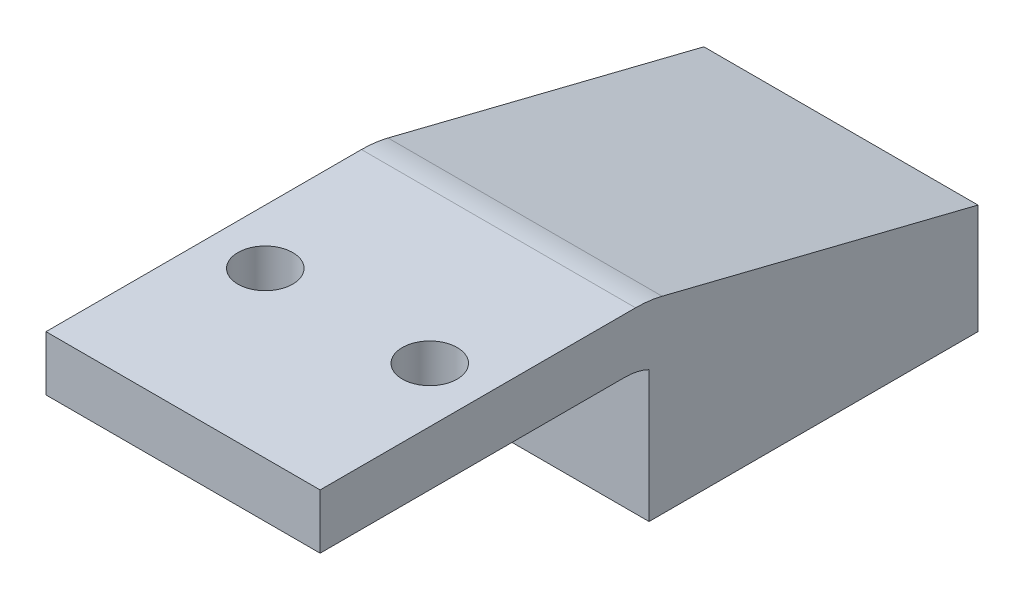
ISO-10303-21;
HEADER;
FILE_DESCRIPTION(('STEP AP214'),'2;1');
FILE_NAME('part.step','',(''),(''),'','','');
FILE_SCHEMA(('AUTOMOTIVE_DESIGN { 1 0 10303 214 1 1 1 1 }'));
ENDSEC;
DATA;
#1=APPLICATION_CONTEXT('core data for automotive mechanical design processes');
#2=APPLICATION_PROTOCOL_DEFINITION('international standard','automotive_design',2000,#1);
#3=PRODUCT_CONTEXT('',#1,'mechanical');
#4=PRODUCT('Part','Part','',(#3));
#5=PRODUCT_RELATED_PRODUCT_CATEGORY('part','',(#4));
#6=PRODUCT_DEFINITION_FORMATION('','',#4);
#7=PRODUCT_DEFINITION_CONTEXT('part definition',#1,'design');
#8=PRODUCT_DEFINITION('design','',#6,#7);
#9=PRODUCT_DEFINITION_SHAPE('','',#8);
#10=(LENGTH_UNIT() NAMED_UNIT(*) SI_UNIT(.MILLI.,.METRE.));
#11=(NAMED_UNIT(*) PLANE_ANGLE_UNIT() SI_UNIT($,.RADIAN.));
#12=(NAMED_UNIT(*) SI_UNIT($,.STERADIAN.) SOLID_ANGLE_UNIT());
#13=UNCERTAINTY_MEASURE_WITH_UNIT(LENGTH_MEASURE(1.E-05),#10,'distance_accuracy_value','');
#14=(GEOMETRIC_REPRESENTATION_CONTEXT(3) GLOBAL_UNCERTAINTY_ASSIGNED_CONTEXT((#13)) GLOBAL_UNIT_ASSIGNED_CONTEXT((#10,
#11,#12)) REPRESENTATION_CONTEXT('',''));
#15=CARTESIAN_POINT('',(0.,0.,0.));
#16=DIRECTION('',(0.,0.,1.));
#17=DIRECTION('',(1.,0.,0.));
#18=AXIS2_PLACEMENT_3D('',#15,#16,#17);
#19=CARTESIAN_POINT('',(50.,-10.,0.));
#20=DIRECTION('',(0.,1.,0.));
#21=DIRECTION('',(0.,0.,1.));
#22=AXIS2_PLACEMENT_3D('',#19,#20,#21);
#23=PLANE('',#22);
#24=DIRECTION('',(-1.,0.,0.));
#25=VECTOR('',#24,1.);
#26=CARTESIAN_POINT('',(50.,-10.,-30.));
#27=LINE('',#26,#25);
#28=CARTESIAN_POINT('',(0.549999999999995,-10.,-30.));
#29=VERTEX_POINT('',#28);
#30=CARTESIAN_POINT('',(0.,-10.,-30.));
#31=VERTEX_POINT('',#30);
#32=EDGE_CURVE('E234',#29,#31,#27,.T.);
#33=ORIENTED_EDGE('',*,*,#32,.F.);
#34=DIRECTION('',(0.,0.,-1.));
#35=VECTOR('',#34,1.);
#36=CARTESIAN_POINT('',(0.549999999999995,-10.,0.));
#37=LINE('',#36,#35);
#38=CARTESIAN_POINT('',(0.549999999999997,-10.,-10.));
#39=VERTEX_POINT('',#38);
#40=EDGE_CURVE('E285',#29,#39,#37,.F.);
#41=ORIENTED_EDGE('',*,*,#40,.T.);
#42=DIRECTION('',(-1.,0.,0.));
#43=VECTOR('',#42,1.);
#44=CARTESIAN_POINT('',(0.,-10.,-10.));
#45=LINE('',#44,#43);
#46=CARTESIAN_POINT('',(11.15,-10.,-10.));
#47=VERTEX_POINT('',#46);
#48=EDGE_CURVE('E205',#47,#39,#45,.T.);
#49=ORIENTED_EDGE('',*,*,#48,.F.);
#50=DIRECTION('',(-1.,0.,0.));
#51=VECTOR('',#50,1.);
#52=CARTESIAN_POINT('',(0.,-10.,-10.));
#53=LINE('',#52,#51);
#54=CARTESIAN_POINT('',(21.75,-10.,-10.));
#55=VERTEX_POINT('',#54);
#56=EDGE_CURVE('E169',#55,#47,#53,.T.);
#57=ORIENTED_EDGE('',*,*,#56,.F.);
#58=DIRECTION('',(0.,0.,-1.));
#59=VECTOR('',#58,1.);
#60=CARTESIAN_POINT('',(21.75,-10.,-30.));
#61=LINE('',#60,#59);
#62=CARTESIAN_POINT('',(21.75,-10.,-30.));
#63=VERTEX_POINT('',#62);
#64=EDGE_CURVE('E282',#55,#63,#61,.T.);
#65=ORIENTED_EDGE('',*,*,#64,.T.);
#66=CARTESIAN_POINT('',(50.,-10.,-30.));
#67=VERTEX_POINT('',#66);
#68=EDGE_CURVE('E250',#67,#63,#27,.T.);
#69=ORIENTED_EDGE('',*,*,#68,.F.);
#70=DIRECTION('',(0.,0.,-1.));
#71=VECTOR('',#70,1.);
#72=CARTESIAN_POINT('',(50.,-10.,0.));
#73=LINE('',#72,#71);
#74=CARTESIAN_POINT('',(50.,-10.,30.));
#75=VERTEX_POINT('',#74);
#76=EDGE_CURVE('E232',#75,#67,#73,.T.);
#77=ORIENTED_EDGE('',*,*,#76,.F.);
#78=DIRECTION('',(-1.,0.,0.));
#79=VECTOR('',#78,1.);
#80=CARTESIAN_POINT('',(50.,-10.,30.));
#81=LINE('',#80,#79);
#82=CARTESIAN_POINT('',(0.,-10.,30.));
#83=VERTEX_POINT('',#82);
#84=EDGE_CURVE('E252',#75,#83,#81,.T.);
#85=ORIENTED_EDGE('',*,*,#84,.T.);
#86=DIRECTION('',(0.,0.,-1.));
#87=VECTOR('',#86,1.);
#88=CARTESIAN_POINT('',(0.,-10.,0.));
#89=LINE('',#88,#87);
#90=EDGE_CURVE('E221',#83,#31,#89,.T.);
#91=ORIENTED_EDGE('',*,*,#90,.T.);
#92=EDGE_LOOP('',(#33,#41,#49,#57,#65,#69,#77,#85,#91));
#93=FACE_BOUND('',#92,.T.);
#94=ADVANCED_FACE('F35',(#93),#23,.F.);
#95=CARTESIAN_POINT('',(50.,0.,-30.));
#96=DIRECTION('',(0.,0.,-1.));
#97=DIRECTION('',(0.,1.,0.));
#98=AXIS2_PLACEMENT_3D('',#95,#96,#97);
#99=PLANE('',#98);
#100=DIRECTION('',(0.,-1.,0.));
#101=VECTOR('',#100,1.);
#102=CARTESIAN_POINT('',(0.,0.,-30.));
#103=LINE('',#102,#101);
#104=CARTESIAN_POINT('',(0.,10.,-30.));
#105=VERTEX_POINT('',#104);
#106=EDGE_CURVE('E216',#105,#31,#103,.T.);
#107=ORIENTED_EDGE('',*,*,#106,.F.);
#108=DIRECTION('',(-1.,0.,0.));
#109=VECTOR('',#108,1.);
#110=CARTESIAN_POINT('',(50.,10.,-30.));
#111=LINE('',#110,#109);
#112=CARTESIAN_POINT('',(50.,10.,-30.));
#113=VERTEX_POINT('',#112);
#114=EDGE_CURVE('E261',#113,#105,#111,.T.);
#115=ORIENTED_EDGE('',*,*,#114,.F.);
#116=DIRECTION('',(0.,-1.,0.));
#117=VECTOR('',#116,1.);
#118=CARTESIAN_POINT('',(50.,0.,-30.));
#119=LINE('',#118,#117);
#120=EDGE_CURVE('E217',#113,#67,#119,.T.);
#121=ORIENTED_EDGE('',*,*,#120,.T.);
#122=ORIENTED_EDGE('',*,*,#68,.T.);
#123=CARTESIAN_POINT('',(21.75,-15.,-30.));
#124=DIRECTION('',(0.,0.,-1.));
#125=DIRECTION('',(0.,1.,0.));
#126=AXIS2_PLACEMENT_3D('',#123,#124,#125);
#127=CIRCLE('',#126,5.);
#128=CARTESIAN_POINT('',(16.75,-15.,-30.));
#129=VERTEX_POINT('',#128);
#130=EDGE_CURVE('E43',#63,#129,#127,.F.);
#131=ORIENTED_EDGE('',*,*,#130,.T.);
#132=DIRECTION('',(0.,1.,0.));
#133=VECTOR('',#132,1.);
#134=CARTESIAN_POINT('',(16.75,0.,-30.));
#135=LINE('',#134,#133);
#136=CARTESIAN_POINT('',(16.75,-15.1,-30.));
#137=VERTEX_POINT('',#136);
#138=EDGE_CURVE('E174',#137,#129,#135,.T.);
#139=ORIENTED_EDGE('',*,*,#138,.F.);
#140=DIRECTION('',(1.,0.,0.));
#141=VECTOR('',#140,1.);
#142=CARTESIAN_POINT('',(1.04777297949E-13,-15.1000000000001,-30.));
#143=LINE('',#142,#141);
#144=CARTESIAN_POINT('',(16.25,-15.1,-30.));
#145=VERTEX_POINT('',#144);
#146=EDGE_CURVE('E171',#145,#137,#143,.T.);
#147=ORIENTED_EDGE('',*,*,#146,.F.);
#148=CARTESIAN_POINT('',(11.15,-15.1,-30.));
#149=DIRECTION('',(0.,0.,-1.));
#150=DIRECTION('',(0.,1.,0.));
#151=AXIS2_PLACEMENT_3D('',#148,#149,#150);
#152=CIRCLE('',#151,5.1);
#153=CARTESIAN_POINT('',(6.05,-15.1,-30.));
#154=VERTEX_POINT('',#153);
#155=EDGE_CURVE('E158',#154,#145,#152,.T.);
#156=ORIENTED_EDGE('',*,*,#155,.F.);
#157=DIRECTION('',(-1.,0.,0.));
#158=VECTOR('',#157,1.);
#159=CARTESIAN_POINT('',(-2.09554595897997E-13,-15.0999999999999,-30.));
#160=LINE('',#159,#158);
#161=CARTESIAN_POINT('',(5.55,-15.1,-30.));
#162=VERTEX_POINT('',#161);
#163=EDGE_CURVE('E168',#154,#162,#160,.T.);
#164=ORIENTED_EDGE('',*,*,#163,.T.);
#165=DIRECTION('',(0.,1.,0.));
#166=VECTOR('',#165,1.);
#167=CARTESIAN_POINT('',(5.55,0.,-30.));
#168=LINE('',#167,#166);
#169=CARTESIAN_POINT('',(5.55,-15.,-30.));
#170=VERTEX_POINT('',#169);
#171=EDGE_CURVE('E199',#162,#170,#168,.T.);
#172=ORIENTED_EDGE('',*,*,#171,.T.);
#173=CARTESIAN_POINT('',(0.549999999999997,-15.,-30.));
#174=DIRECTION('',(0.,0.,-1.));
#175=DIRECTION('',(0.,1.,0.));
#176=AXIS2_PLACEMENT_3D('',#173,#174,#175);
#177=CIRCLE('',#176,5.);
#178=EDGE_CURVE('E289',#170,#29,#177,.F.);
#179=ORIENTED_EDGE('',*,*,#178,.T.);
#180=ORIENTED_EDGE('',*,*,#32,.T.);
#181=EDGE_LOOP('',(#107,#115,#121,#122,#131,#139,#147,#156,#164,#172,#179,#180));
#182=FACE_BOUND('',#181,.T.);
#183=ADVANCED_FACE('F173',(#182),#99,.T.);
#184=CARTESIAN_POINT('',(50.,16.4705882352941,-4.11764705882353));
#185=DIRECTION('',(0.,0.970142500145332,-0.242535625036333));
#186=DIRECTION('',(0.,0.242535625036333,0.970142500145332));
#187=AXIS2_PLACEMENT_3D('',#184,#185,#186);
#188=PLANE('',#187);
#189=DIRECTION('',(0.,-0.242535625036333,-0.970142500145332));
#190=VECTOR('',#189,1.);
#191=CARTESIAN_POINT('',(0.,16.4705882352941,-4.11764705882353));
#192=LINE('',#191,#190);
#193=CARTESIAN_POINT('',(0.,24.4028500029066,27.6114000116265));
#194=VERTEX_POINT('',#193);
#195=EDGE_CURVE('E237',#194,#105,#192,.T.);
#196=ORIENTED_EDGE('',*,*,#195,.F.);
#197=DIRECTION('',(-1.,0.,0.));
#198=VECTOR('',#197,1.);
#199=CARTESIAN_POINT('',(50.,24.4028500029066,27.6114000116265));
#200=LINE('',#199,#198);
#201=CARTESIAN_POINT('',(50.,24.4028500029066,27.6114000116265));
#202=VERTEX_POINT('',#201);
#203=EDGE_CURVE('E269',#194,#202,#200,.F.);
#204=ORIENTED_EDGE('',*,*,#203,.T.);
#205=DIRECTION('',(0.,-0.242535625036333,-0.970142500145332));
#206=VECTOR('',#205,1.);
#207=CARTESIAN_POINT('',(50.,16.4705882352941,-4.11764705882353));
#208=LINE('',#207,#206);
#209=EDGE_CURVE('E220',#202,#113,#208,.T.);
#210=ORIENTED_EDGE('',*,*,#209,.T.);
#211=ORIENTED_EDGE('',*,*,#114,.T.);
#212=EDGE_LOOP('',(#196,#204,#210,#211));
#213=FACE_BOUND('',#212,.T.);
#214=ADVANCED_FACE('F346',(#213),#188,.T.);
#215=CARTESIAN_POINT('',(50.,25.,0.));
#216=DIRECTION('',(0.,-1.,0.));
#217=DIRECTION('',(0.,0.,-1.));
#218=AXIS2_PLACEMENT_3D('',#215,#216,#217);
#219=PLANE('',#218);
#220=CARTESIAN_POINT('',(10.,25.,60.));
#221=DIRECTION('',(0.,1.,0.));
#222=DIRECTION('',(0.,0.,1.));
#223=AXIS2_PLACEMENT_3D('',#220,#221,#222);
#224=CIRCLE('',#223,5.);
#225=CARTESIAN_POINT('',(10.,25.,65.));
#226=VERTEX_POINT('',#225);
#227=EDGE_CURVE('E399',#226,#226,#224,.T.);
#228=ORIENTED_EDGE('',*,*,#227,.F.);
#229=EDGE_LOOP('',(#228));
#230=FACE_BOUND('',#229,.T.);
#231=CARTESIAN_POINT('',(40.,25.,60.));
#232=DIRECTION('',(0.,1.,0.));
#233=DIRECTION('',(0.,0.,1.));
#234=AXIS2_PLACEMENT_3D('',#231,#232,#233);
#235=CIRCLE('',#234,5.);
#236=CARTESIAN_POINT('',(40.,25.,65.));
#237=VERTEX_POINT('',#236);
#238=EDGE_CURVE('E397',#237,#237,#235,.T.);
#239=ORIENTED_EDGE('',*,*,#238,.F.);
#240=EDGE_LOOP('',(#239));
#241=FACE_BOUND('',#240,.T.);
#242=DIRECTION('',(0.,0.,1.));
#243=VECTOR('',#242,1.);
#244=CARTESIAN_POINT('',(50.,25.,0.));
#245=LINE('',#244,#243);
#246=CARTESIAN_POINT('',(50.,25.,32.4621125123532));
#247=VERTEX_POINT('',#246);
#248=CARTESIAN_POINT('',(50.,25.,90.));
#249=VERTEX_POINT('',#248);
#250=EDGE_CURVE('E223',#247,#249,#245,.T.);
#251=ORIENTED_EDGE('',*,*,#250,.F.);
#252=DIRECTION('',(-1.,0.,0.));
#253=VECTOR('',#252,1.);
#254=CARTESIAN_POINT('',(0.,25.,32.4621125123532));
#255=LINE('',#254,#253);
#256=CARTESIAN_POINT('',(0.,25.,32.4621125123532));
#257=VERTEX_POINT('',#256);
#258=EDGE_CURVE('E264',#247,#257,#255,.T.);
#259=ORIENTED_EDGE('',*,*,#258,.T.);
#260=DIRECTION('',(0.,0.,1.));
#261=VECTOR('',#260,1.);
#262=CARTESIAN_POINT('',(0.,25.,0.));
#263=LINE('',#262,#261);
#264=CARTESIAN_POINT('',(0.,25.,90.));
#265=VERTEX_POINT('',#264);
#266=EDGE_CURVE('E239',#257,#265,#263,.T.);
#267=ORIENTED_EDGE('',*,*,#266,.T.);
#268=DIRECTION('',(-1.,0.,0.));
#269=VECTOR('',#268,1.);
#270=CARTESIAN_POINT('',(50.,25.,90.));
#271=LINE('',#270,#269);
#272=EDGE_CURVE('E258',#249,#265,#271,.T.);
#273=ORIENTED_EDGE('',*,*,#272,.F.);
#274=EDGE_LOOP('',(#251,#259,#267,#273));
#275=FACE_BOUND('',#274,.T.);
#276=ADVANCED_FACE('F362',(#230,#241,#275),#219,.F.);
#277=CARTESIAN_POINT('',(50.,0.,90.));
#278=DIRECTION('',(0.,0.,-1.));
#279=DIRECTION('',(-1.,0.,0.));
#280=AXIS2_PLACEMENT_3D('',#277,#278,#279);
#281=PLANE('',#280);
#282=DIRECTION('',(0.,-1.,0.));
#283=VECTOR('',#282,1.);
#284=CARTESIAN_POINT('',(0.,0.,90.));
#285=LINE('',#284,#283);
#286=CARTESIAN_POINT('',(0.,15.,90.));
#287=VERTEX_POINT('',#286);
#288=EDGE_CURVE('E241',#265,#287,#285,.T.);
#289=ORIENTED_EDGE('',*,*,#288,.T.);
#290=DIRECTION('',(-1.,0.,0.));
#291=VECTOR('',#290,1.);
#292=CARTESIAN_POINT('',(50.,15.,90.));
#293=LINE('',#292,#291);
#294=CARTESIAN_POINT('',(50.,15.,90.));
#295=VERTEX_POINT('',#294);
#296=EDGE_CURVE('E255',#295,#287,#293,.T.);
#297=ORIENTED_EDGE('',*,*,#296,.F.);
#298=DIRECTION('',(0.,-1.,0.));
#299=VECTOR('',#298,1.);
#300=CARTESIAN_POINT('',(50.,0.,90.));
#301=LINE('',#300,#299);
#302=EDGE_CURVE('E225',#249,#295,#301,.T.);
#303=ORIENTED_EDGE('',*,*,#302,.F.);
#304=ORIENTED_EDGE('',*,*,#272,.T.);
#305=EDGE_LOOP('',(#289,#297,#303,#304));
#306=FACE_BOUND('',#305,.T.);
#307=ADVANCED_FACE('F358',(#306),#281,.F.);
#308=CARTESIAN_POINT('',(50.,15.,0.));
#309=DIRECTION('',(0.,1.,0.));
#310=DIRECTION('',(0.,0.,1.));
#311=AXIS2_PLACEMENT_3D('',#308,#309,#310);
#312=PLANE('',#311);
#313=CARTESIAN_POINT('',(10.,15.,60.));
#314=DIRECTION('',(0.,1.,0.));
#315=DIRECTION('',(0.,0.,1.));
#316=AXIS2_PLACEMENT_3D('',#313,#314,#315);
#317=CIRCLE('',#316,5.);
#318=CARTESIAN_POINT('',(10.,15.,65.));
#319=VERTEX_POINT('',#318);
#320=EDGE_CURVE('E178',#319,#319,#317,.T.);
#321=ORIENTED_EDGE('',*,*,#320,.T.);
#322=EDGE_LOOP('',(#321));
#323=FACE_BOUND('',#322,.T.);
#324=CARTESIAN_POINT('',(40.,15.,60.));
#325=DIRECTION('',(0.,1.,0.));
#326=DIRECTION('',(0.,0.,1.));
#327=AXIS2_PLACEMENT_3D('',#324,#325,#326);
#328=CIRCLE('',#327,5.);
#329=CARTESIAN_POINT('',(40.,15.,65.));
#330=VERTEX_POINT('',#329);
#331=EDGE_CURVE('E394',#330,#330,#328,.T.);
#332=ORIENTED_EDGE('',*,*,#331,.T.);
#333=EDGE_LOOP('',(#332));
#334=FACE_BOUND('',#333,.T.);
#335=DIRECTION('',(0.,0.,-1.));
#336=VECTOR('',#335,1.);
#337=CARTESIAN_POINT('',(0.,15.,0.));
#338=LINE('',#337,#336);
#339=CARTESIAN_POINT('',(0.,15.,34.3588989435407));
#340=VERTEX_POINT('',#339);
#341=EDGE_CURVE('E243',#287,#340,#338,.T.);
#342=ORIENTED_EDGE('',*,*,#341,.T.);
#343=DIRECTION('',(1.,0.,0.));
#344=VECTOR('',#343,1.);
#345=CARTESIAN_POINT('',(50.,15.,34.3588989435407));
#346=LINE('',#345,#344);
#347=CARTESIAN_POINT('',(50.,15.,34.3588989435407));
#348=VERTEX_POINT('',#347);
#349=EDGE_CURVE('E273',#340,#348,#346,.T.);
#350=ORIENTED_EDGE('',*,*,#349,.T.);
#351=DIRECTION('',(0.,0.,-1.));
#352=VECTOR('',#351,1.);
#353=CARTESIAN_POINT('',(50.,15.,0.));
#354=LINE('',#353,#352);
#355=EDGE_CURVE('E227',#295,#348,#354,.T.);
#356=ORIENTED_EDGE('',*,*,#355,.F.);
#357=ORIENTED_EDGE('',*,*,#296,.T.);
#358=EDGE_LOOP('',(#342,#350,#356,#357));
#359=FACE_BOUND('',#358,.T.);
#360=ADVANCED_FACE('F354',(#323,#334,#359),#312,.F.);
#361=CARTESIAN_POINT('',(50.,0.,30.));
#362=DIRECTION('',(0.,0.,-1.));
#363=DIRECTION('',(0.,1.,0.));
#364=AXIS2_PLACEMENT_3D('',#361,#362,#363);
#365=PLANE('',#364);
#366=DIRECTION('',(0.,-1.,0.));
#367=VECTOR('',#366,1.);
#368=CARTESIAN_POINT('',(50.,0.,30.));
#369=LINE('',#368,#367);
#370=CARTESIAN_POINT('',(50.,14.,30.));
#371=VERTEX_POINT('',#370);
#372=EDGE_CURVE('E230',#371,#75,#369,.T.);
#373=ORIENTED_EDGE('',*,*,#372,.F.);
#374=DIRECTION('',(-1.,0.,0.));
#375=VECTOR('',#374,1.);
#376=CARTESIAN_POINT('',(50.,14.,30.));
#377=LINE('',#376,#375);
#378=CARTESIAN_POINT('',(0.,14.,30.));
#379=VERTEX_POINT('',#378);
#380=EDGE_CURVE('E212',#371,#379,#377,.T.);
#381=ORIENTED_EDGE('',*,*,#380,.T.);
#382=DIRECTION('',(0.,-1.,0.));
#383=VECTOR('',#382,1.);
#384=CARTESIAN_POINT('',(0.,0.,30.));
#385=LINE('',#384,#383);
#386=EDGE_CURVE('E246',#379,#83,#385,.T.);
#387=ORIENTED_EDGE('',*,*,#386,.T.);
#388=ORIENTED_EDGE('',*,*,#84,.F.);
#389=EDGE_LOOP('',(#373,#381,#387,#388));
#390=FACE_BOUND('',#389,.T.);
#391=ADVANCED_FACE('F351',(#390),#365,.F.);
#392=CARTESIAN_POINT('',(50.,0.,0.));
#393=DIRECTION('',(1.,0.,0.));
#394=DIRECTION('',(0.,0.,-1.));
#395=AXIS2_PLACEMENT_3D('',#392,#393,#394);
#396=PLANE('',#395);
#397=ORIENTED_EDGE('',*,*,#209,.F.);
#398=CARTESIAN_POINT('',(50.,5.,32.4621125123532));
#399=DIRECTION('',(1.,0.,0.));
#400=DIRECTION('',(0.,0.,-1.));
#401=AXIS2_PLACEMENT_3D('',#398,#399,#400);
#402=CIRCLE('',#401,20.);
#403=EDGE_CURVE('E271',#202,#247,#402,.T.);
#404=ORIENTED_EDGE('',*,*,#403,.T.);
#405=ORIENTED_EDGE('',*,*,#250,.T.);
#406=ORIENTED_EDGE('',*,*,#302,.T.);
#407=ORIENTED_EDGE('',*,*,#355,.T.);
#408=CARTESIAN_POINT('',(50.,4.99999999999999,34.3588989435407));
#409=DIRECTION('',(1.,0.,0.));
#410=DIRECTION('',(0.,0.,-1.));
#411=AXIS2_PLACEMENT_3D('',#408,#409,#410);
#412=CIRCLE('',#411,10.);
#413=EDGE_CURVE('E277',#348,#371,#412,.F.);
#414=ORIENTED_EDGE('',*,*,#413,.T.);
#415=ORIENTED_EDGE('',*,*,#372,.T.);
#416=ORIENTED_EDGE('',*,*,#76,.T.);
#417=ORIENTED_EDGE('',*,*,#120,.F.);
#418=EDGE_LOOP('',(#397,#404,#405,#406,#407,#414,#415,#416,#417));
#419=FACE_BOUND('',#418,.T.);
#420=ADVANCED_FACE('F320',(#419),#396,.T.);
#421=CARTESIAN_POINT('',(0.,0.,0.));
#422=DIRECTION('',(1.,0.,0.));
#423=DIRECTION('',(0.,0.,-1.));
#424=AXIS2_PLACEMENT_3D('',#421,#422,#423);
#425=PLANE('',#424);
#426=ORIENTED_EDGE('',*,*,#266,.F.);
#427=CARTESIAN_POINT('',(0.,5.,32.4621125123532));
#428=DIRECTION('',(1.,0.,0.));
#429=DIRECTION('',(0.,0.,-1.));
#430=AXIS2_PLACEMENT_3D('',#427,#428,#429);
#431=CIRCLE('',#430,20.);
#432=EDGE_CURVE('E267',#257,#194,#431,.F.);
#433=ORIENTED_EDGE('',*,*,#432,.T.);
#434=ORIENTED_EDGE('',*,*,#195,.T.);
#435=ORIENTED_EDGE('',*,*,#106,.T.);
#436=ORIENTED_EDGE('',*,*,#90,.F.);
#437=ORIENTED_EDGE('',*,*,#386,.F.);
#438=CARTESIAN_POINT('',(0.,4.99999999999999,34.3588989435407));
#439=DIRECTION('',(1.,0.,0.));
#440=DIRECTION('',(0.,0.,-1.));
#441=AXIS2_PLACEMENT_3D('',#438,#439,#440);
#442=CIRCLE('',#441,10.);
#443=EDGE_CURVE('E275',#379,#340,#442,.T.);
#444=ORIENTED_EDGE('',*,*,#443,.T.);
#445=ORIENTED_EDGE('',*,*,#341,.F.);
#446=ORIENTED_EDGE('',*,*,#288,.F.);
#447=EDGE_LOOP('',(#426,#433,#434,#435,#436,#437,#444,#445,#446));
#448=FACE_BOUND('',#447,.T.);
#449=ADVANCED_FACE('F313',(#448),#425,.F.);
#450=CARTESIAN_POINT('',(50.,5.,32.4621125123532));
#451=DIRECTION('',(1.,0.,0.));
#452=DIRECTION('',(0.,0.,-1.));
#453=AXIS2_PLACEMENT_3D('',#450,#451,#452);
#454=CYLINDRICAL_SURFACE('',#453,20.);
#455=ORIENTED_EDGE('',*,*,#403,.F.);
#456=ORIENTED_EDGE('',*,*,#203,.F.);
#457=ORIENTED_EDGE('',*,*,#432,.F.);
#458=ORIENTED_EDGE('',*,*,#258,.F.);
#459=EDGE_LOOP('',(#455,#456,#457,#458));
#460=FACE_BOUND('',#459,.T.);
#461=ADVANCED_FACE('F369',(#460),#454,.T.);
#462=CARTESIAN_POINT('',(50.,4.99999999999999,34.3588989435407));
#463=DIRECTION('',(1.,0.,0.));
#464=DIRECTION('',(0.,0.,-1.));
#465=AXIS2_PLACEMENT_3D('',#462,#463,#464);
#466=CYLINDRICAL_SURFACE('',#465,10.);
#467=ORIENTED_EDGE('',*,*,#413,.F.);
#468=ORIENTED_EDGE('',*,*,#349,.F.);
#469=ORIENTED_EDGE('',*,*,#443,.F.);
#470=ORIENTED_EDGE('',*,*,#380,.F.);
#471=EDGE_LOOP('',(#467,#468,#469,#470));
#472=FACE_BOUND('',#471,.T.);
#473=ADVANCED_FACE('F372',(#472),#466,.F.);
#474=CARTESIAN_POINT('',(11.15,-15.1,-10.));
#475=DIRECTION('',(0.,0.,-1.));
#476=DIRECTION('',(0.,1.,0.));
#477=AXIS2_PLACEMENT_3D('',#474,#475,#476);
#478=CYLINDRICAL_SURFACE('',#477,5.1);
#479=ORIENTED_EDGE('',*,*,#155,.T.);
#480=DIRECTION('',(0.,0.,-1.));
#481=VECTOR('',#480,1.);
#482=CARTESIAN_POINT('',(16.25,-15.1,-10.));
#483=LINE('',#482,#481);
#484=CARTESIAN_POINT('',(16.25,-15.1,-10.));
#485=VERTEX_POINT('',#484);
#486=EDGE_CURVE('E163',#485,#145,#483,.T.);
#487=ORIENTED_EDGE('',*,*,#486,.F.);
#488=CARTESIAN_POINT('',(11.15,-15.1,-10.));
#489=DIRECTION('',(0.,0.,-1.));
#490=DIRECTION('',(0.,1.,0.));
#491=AXIS2_PLACEMENT_3D('',#488,#489,#490);
#492=CIRCLE('',#491,5.1);
#493=EDGE_CURVE('E191',#47,#485,#492,.T.);
#494=ORIENTED_EDGE('',*,*,#493,.F.);
#495=CARTESIAN_POINT('',(11.15,-15.1,-10.));
#496=DIRECTION('',(0.,0.,-1.));
#497=DIRECTION('',(0.,1.,0.));
#498=AXIS2_PLACEMENT_3D('',#495,#496,#497);
#499=CIRCLE('',#498,5.1);
#500=CARTESIAN_POINT('',(6.05,-15.1,-10.));
#501=VERTEX_POINT('',#500);
#502=EDGE_CURVE('E196',#501,#47,#499,.T.);
#503=ORIENTED_EDGE('',*,*,#502,.F.);
#504=DIRECTION('',(0.,0.,-1.));
#505=VECTOR('',#504,1.);
#506=CARTESIAN_POINT('',(6.05,-15.1,-10.));
#507=LINE('',#506,#505);
#508=EDGE_CURVE('E165',#501,#154,#507,.T.);
#509=ORIENTED_EDGE('',*,*,#508,.T.);
#510=EDGE_LOOP('',(#479,#487,#494,#503,#509));
#511=FACE_BOUND('',#510,.T.);
#512=ADVANCED_FACE('F160',(#511),#478,.F.);
#513=CARTESIAN_POINT('',(5.55,0.,-10.));
#514=DIRECTION('',(-1.,0.,0.));
#515=DIRECTION('',(0.,0.,1.));
#516=AXIS2_PLACEMENT_3D('',#513,#514,#515);
#517=PLANE('',#516);
#518=DIRECTION('',(0.,1.,0.));
#519=VECTOR('',#518,1.);
#520=CARTESIAN_POINT('',(5.55,0.,-10.));
#521=LINE('',#520,#519);
#522=CARTESIAN_POINT('',(5.55,-15.1,-10.));
#523=VERTEX_POINT('',#522);
#524=CARTESIAN_POINT('',(5.55,-15.,-10.));
#525=VERTEX_POINT('',#524);
#526=EDGE_CURVE('E202',#523,#525,#521,.T.);
#527=ORIENTED_EDGE('',*,*,#526,.T.);
#528=DIRECTION('',(0.,0.,-1.));
#529=VECTOR('',#528,1.);
#530=CARTESIAN_POINT('',(5.55,-15.,-10.));
#531=LINE('',#530,#529);
#532=EDGE_CURVE('E279',#525,#170,#531,.T.);
#533=ORIENTED_EDGE('',*,*,#532,.T.);
#534=ORIENTED_EDGE('',*,*,#171,.F.);
#535=DIRECTION('',(0.,0.,-1.));
#536=VECTOR('',#535,1.);
#537=CARTESIAN_POINT('',(5.55,-15.1,-10.));
#538=LINE('',#537,#536);
#539=EDGE_CURVE('E210',#523,#162,#538,.T.);
#540=ORIENTED_EDGE('',*,*,#539,.F.);
#541=EDGE_LOOP('',(#527,#533,#534,#540));
#542=FACE_BOUND('',#541,.T.);
#543=ADVANCED_FACE('F302',(#542),#517,.T.);
#544=CARTESIAN_POINT('',(-2.09554595897997E-13,-15.0999999999999,-10.));
#545=DIRECTION('',(0.,-1.,0.));
#546=DIRECTION('',(1.,0.,0.));
#547=AXIS2_PLACEMENT_3D('',#544,#545,#546);
#548=PLANE('',#547);
#549=ORIENTED_EDGE('',*,*,#163,.F.);
#550=ORIENTED_EDGE('',*,*,#508,.F.);
#551=DIRECTION('',(-1.,0.,0.));
#552=VECTOR('',#551,1.);
#553=CARTESIAN_POINT('',(-2.09554595897997E-13,-15.0999999999999,-10.));
#554=LINE('',#553,#552);
#555=EDGE_CURVE('E198',#501,#523,#554,.T.);
#556=ORIENTED_EDGE('',*,*,#555,.T.);
#557=ORIENTED_EDGE('',*,*,#539,.T.);
#558=EDGE_LOOP('',(#549,#550,#556,#557));
#559=FACE_BOUND('',#558,.T.);
#560=ADVANCED_FACE('F465',(#559),#548,.T.);
#561=CARTESIAN_POINT('',(0.,0.,-10.));
#562=DIRECTION('',(0.,0.,-1.));
#563=DIRECTION('',(0.,1.,0.));
#564=AXIS2_PLACEMENT_3D('',#561,#562,#563);
#565=PLANE('',#564);
#566=ORIENTED_EDGE('',*,*,#502,.T.);
#567=ORIENTED_EDGE('',*,*,#48,.T.);
#568=CARTESIAN_POINT('',(0.549999999999997,-15.,-10.));
#569=DIRECTION('',(0.,0.,-1.));
#570=DIRECTION('',(0.,1.,0.));
#571=AXIS2_PLACEMENT_3D('',#568,#569,#570);
#572=CIRCLE('',#571,5.);
#573=EDGE_CURVE('E291',#39,#525,#572,.T.);
#574=ORIENTED_EDGE('',*,*,#573,.T.);
#575=ORIENTED_EDGE('',*,*,#526,.F.);
#576=ORIENTED_EDGE('',*,*,#555,.F.);
#577=EDGE_LOOP('',(#566,#567,#574,#575,#576));
#578=FACE_BOUND('',#577,.T.);
#579=ADVANCED_FACE('F295',(#578),#565,.F.);
#580=CARTESIAN_POINT('',(1.04777297949E-13,-15.1000000000001,-10.));
#581=DIRECTION('',(0.,1.,0.));
#582=DIRECTION('',(-1.,0.,0.));
#583=AXIS2_PLACEMENT_3D('',#580,#581,#582);
#584=PLANE('',#583);
#585=ORIENTED_EDGE('',*,*,#146,.T.);
#586=DIRECTION('',(0.,0.,-1.));
#587=VECTOR('',#586,1.);
#588=CARTESIAN_POINT('',(16.75,-15.1,-10.));
#589=LINE('',#588,#587);
#590=CARTESIAN_POINT('',(16.75,-15.1,-10.));
#591=VERTEX_POINT('',#590);
#592=EDGE_CURVE('E184',#591,#137,#589,.T.);
#593=ORIENTED_EDGE('',*,*,#592,.F.);
#594=DIRECTION('',(1.,0.,0.));
#595=VECTOR('',#594,1.);
#596=CARTESIAN_POINT('',(1.04777297949E-13,-15.1000000000001,-10.));
#597=LINE('',#596,#595);
#598=EDGE_CURVE('E181',#485,#591,#597,.T.);
#599=ORIENTED_EDGE('',*,*,#598,.F.);
#600=ORIENTED_EDGE('',*,*,#486,.T.);
#601=EDGE_LOOP('',(#585,#593,#599,#600));
#602=FACE_BOUND('',#601,.T.);
#603=ADVANCED_FACE('F180',(#602),#584,.F.);
#604=CARTESIAN_POINT('',(16.75,0.,-10.));
#605=DIRECTION('',(-1.,0.,0.));
#606=DIRECTION('',(0.,0.,1.));
#607=AXIS2_PLACEMENT_3D('',#604,#605,#606);
#608=PLANE('',#607);
#609=ORIENTED_EDGE('',*,*,#138,.T.);
#610=DIRECTION('',(0.,0.,-1.));
#611=VECTOR('',#610,1.);
#612=CARTESIAN_POINT('',(16.75,-15.,-10.));
#613=LINE('',#612,#611);
#614=CARTESIAN_POINT('',(16.75,-15.,-10.));
#615=VERTEX_POINT('',#614);
#616=EDGE_CURVE('E50',#129,#615,#613,.F.);
#617=ORIENTED_EDGE('',*,*,#616,.T.);
#618=DIRECTION('',(0.,1.,0.));
#619=VECTOR('',#618,1.);
#620=CARTESIAN_POINT('',(16.75,0.,-10.));
#621=LINE('',#620,#619);
#622=EDGE_CURVE('E190',#591,#615,#621,.T.);
#623=ORIENTED_EDGE('',*,*,#622,.F.);
#624=ORIENTED_EDGE('',*,*,#592,.T.);
#625=EDGE_LOOP('',(#609,#617,#623,#624));
#626=FACE_BOUND('',#625,.T.);
#627=ADVANCED_FACE('F329',(#626),#608,.F.);
#628=CARTESIAN_POINT('',(0.,0.,-10.));
#629=DIRECTION('',(0.,0.,-1.));
#630=DIRECTION('',(0.,1.,0.));
#631=AXIS2_PLACEMENT_3D('',#628,#629,#630);
#632=PLANE('',#631);
#633=ORIENTED_EDGE('',*,*,#493,.T.);
#634=ORIENTED_EDGE('',*,*,#598,.T.);
#635=ORIENTED_EDGE('',*,*,#622,.T.);
#636=CARTESIAN_POINT('',(21.75,-15.,-10.));
#637=DIRECTION('',(0.,0.,-1.));
#638=DIRECTION('',(0.,1.,0.));
#639=AXIS2_PLACEMENT_3D('',#636,#637,#638);
#640=CIRCLE('',#639,5.);
#641=EDGE_CURVE('E11',#615,#55,#640,.T.);
#642=ORIENTED_EDGE('',*,*,#641,.T.);
#643=ORIENTED_EDGE('',*,*,#56,.T.);
#644=EDGE_LOOP('',(#633,#634,#635,#642,#643));
#645=FACE_BOUND('',#644,.T.);
#646=ADVANCED_FACE('F328',(#645),#632,.F.);
#647=CARTESIAN_POINT('',(0.549999999999997,-15.,-10.));
#648=DIRECTION('',(0.,0.,-1.));
#649=DIRECTION('',(-1.,0.,0.));
#650=AXIS2_PLACEMENT_3D('',#647,#648,#649);
#651=CYLINDRICAL_SURFACE('',#650,5.);
#652=ORIENTED_EDGE('',*,*,#573,.F.);
#653=ORIENTED_EDGE('',*,*,#40,.F.);
#654=ORIENTED_EDGE('',*,*,#178,.F.);
#655=ORIENTED_EDGE('',*,*,#532,.F.);
#656=EDGE_LOOP('',(#652,#653,#654,#655));
#657=FACE_BOUND('',#656,.T.);
#658=ADVANCED_FACE('F304',(#657),#651,.F.);
#659=CARTESIAN_POINT('',(21.75,-15.,0.));
#660=DIRECTION('',(0.,0.,1.));
#661=DIRECTION('',(1.,0.,0.));
#662=AXIS2_PLACEMENT_3D('',#659,#660,#661);
#663=CYLINDRICAL_SURFACE('',#662,5.);
#664=ORIENTED_EDGE('',*,*,#641,.F.);
#665=ORIENTED_EDGE('',*,*,#616,.F.);
#666=ORIENTED_EDGE('',*,*,#130,.F.);
#667=ORIENTED_EDGE('',*,*,#64,.F.);
#668=EDGE_LOOP('',(#664,#665,#666,#667));
#669=FACE_BOUND('',#668,.T.);
#670=ADVANCED_FACE('F37',(#669),#663,.F.);
#671=CARTESIAN_POINT('',(40.,15.,60.));
#672=DIRECTION('',(0.,1.,0.));
#673=DIRECTION('',(0.,0.,1.));
#674=AXIS2_PLACEMENT_3D('',#671,#672,#673);
#675=CYLINDRICAL_SURFACE('',#674,5.);
#676=ORIENTED_EDGE('',*,*,#331,.F.);
#677=EDGE_LOOP('',(#676));
#678=FACE_BOUND('',#677,.T.);
#679=ORIENTED_EDGE('',*,*,#238,.T.);
#680=EDGE_LOOP('',(#679));
#681=FACE_BOUND('',#680,.T.);
#682=ADVANCED_FACE('F380',(#678,#681),#675,.F.);
#683=CARTESIAN_POINT('',(10.,15.,60.));
#684=DIRECTION('',(0.,1.,0.));
#685=DIRECTION('',(0.,0.,1.));
#686=AXIS2_PLACEMENT_3D('',#683,#684,#685);
#687=CYLINDRICAL_SURFACE('',#686,5.);
#688=ORIENTED_EDGE('',*,*,#320,.F.);
#689=EDGE_LOOP('',(#688));
#690=FACE_BOUND('',#689,.T.);
#691=ORIENTED_EDGE('',*,*,#227,.T.);
#692=EDGE_LOOP('',(#691));
#693=FACE_BOUND('',#692,.T.);
#694=ADVANCED_FACE('F384',(#690,#693),#687,.F.);
#695=CLOSED_SHELL('',(#94,#183,#214,#276,#307,#360,#391,#420,#449,#461,#473,#512,#543,#560,#579,
#603,#627,#646,#658,#670,#682,#694));
#696=MANIFOLD_SOLID_BREP('B2',#695);
#697=ADVANCED_BREP_SHAPE_REPRESENTATION('',(#18,#696),#14);
#698=SHAPE_DEFINITION_REPRESENTATION(#9,#697);
ENDSEC;
END-ISO-10303-21;
